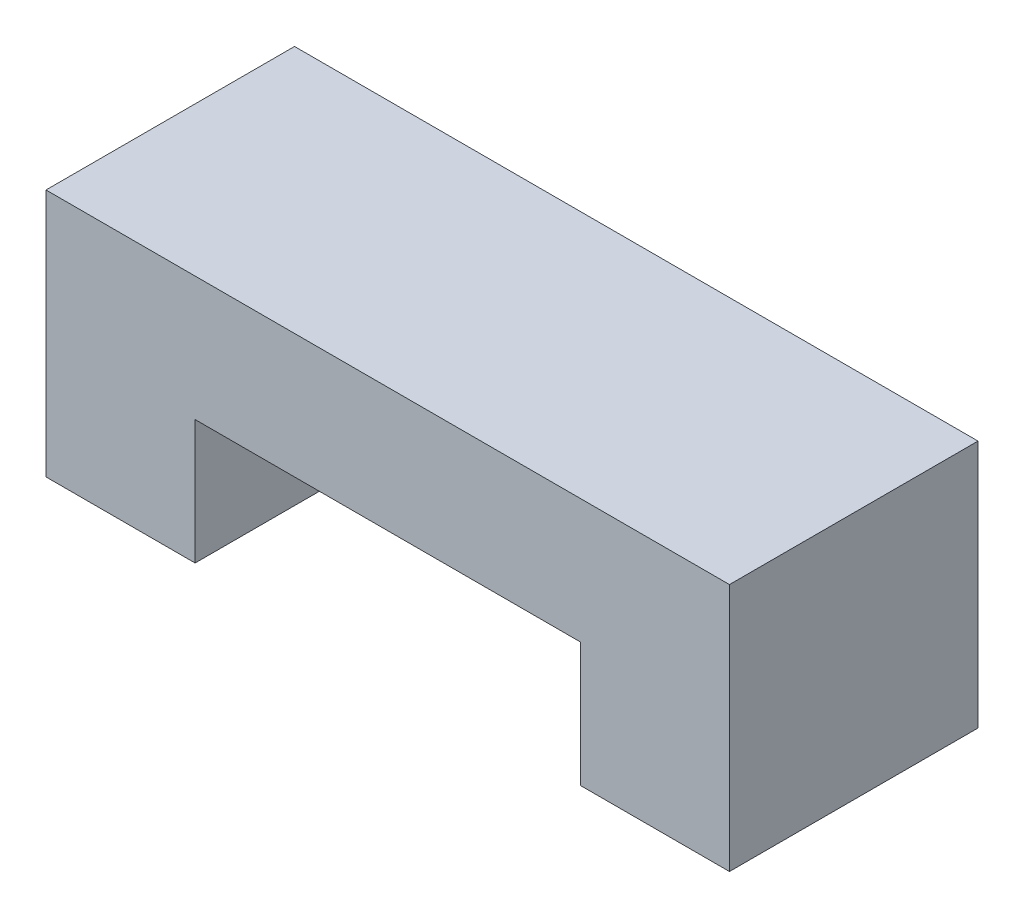
ISO-10303-21;
HEADER;
FILE_DESCRIPTION(('STEP AP214'),'2;1');
FILE_NAME('part.step','',(''),(''),'','','');
FILE_SCHEMA(('AUTOMOTIVE_DESIGN { 1 0 10303 214 1 1 1 1 }'));
ENDSEC;
DATA;
#1=APPLICATION_CONTEXT('core data for automotive mechanical design processes');
#2=APPLICATION_PROTOCOL_DEFINITION('international standard','automotive_design',2000,#1);
#3=PRODUCT_CONTEXT('',#1,'mechanical');
#4=PRODUCT('Part','Part','',(#3));
#5=PRODUCT_RELATED_PRODUCT_CATEGORY('part','',(#4));
#6=PRODUCT_DEFINITION_FORMATION('','',#4);
#7=PRODUCT_DEFINITION_CONTEXT('part definition',#1,'design');
#8=PRODUCT_DEFINITION('design','',#6,#7);
#9=PRODUCT_DEFINITION_SHAPE('','',#8);
#10=(LENGTH_UNIT() NAMED_UNIT(*) SI_UNIT(.MILLI.,.METRE.));
#11=(NAMED_UNIT(*) PLANE_ANGLE_UNIT() SI_UNIT($,.RADIAN.));
#12=(NAMED_UNIT(*) SI_UNIT($,.STERADIAN.) SOLID_ANGLE_UNIT());
#13=UNCERTAINTY_MEASURE_WITH_UNIT(LENGTH_MEASURE(1.E-05),#10,'distance_accuracy_value','');
#14=(GEOMETRIC_REPRESENTATION_CONTEXT(3) GLOBAL_UNCERTAINTY_ASSIGNED_CONTEXT((#13)) GLOBAL_UNIT_ASSIGNED_CONTEXT((#10,
#11,#12)) REPRESENTATION_CONTEXT('',''));
#15=CARTESIAN_POINT('',(0.,0.,0.));
#16=DIRECTION('',(0.,0.,1.));
#17=DIRECTION('',(1.,0.,0.));
#18=AXIS2_PLACEMENT_3D('',#15,#16,#17);
#19=CARTESIAN_POINT('',(0.,20.,20.));
#20=DIRECTION('',(1.,0.,0.));
#21=DIRECTION('',(0.,1.,0.));
#22=AXIS2_PLACEMENT_3D('',#19,#20,#21);
#23=PLANE('',#22);
#24=DIRECTION('',(0.,-1.,0.));
#25=VECTOR('',#24,1.);
#26=CARTESIAN_POINT('',(0.,20.,0.));
#27=LINE('',#26,#25);
#28=CARTESIAN_POINT('',(0.,20.,0.));
#29=VERTEX_POINT('',#28);
#30=CARTESIAN_POINT('',(0.,0.,0.));
#31=VERTEX_POINT('',#30);
#32=EDGE_CURVE('E133',#29,#31,#27,.T.);
#33=ORIENTED_EDGE('',*,*,#32,.T.);
#34=DIRECTION('',(0.,0.,-1.));
#35=VECTOR('',#34,1.);
#36=CARTESIAN_POINT('',(0.,0.,20.));
#37=LINE('',#36,#35);
#38=CARTESIAN_POINT('',(0.,0.,20.));
#39=VERTEX_POINT('',#38);
#40=EDGE_CURVE('E11',#39,#31,#37,.T.);
#41=ORIENTED_EDGE('',*,*,#40,.F.);
#42=DIRECTION('',(0.,-1.,0.));
#43=VECTOR('',#42,1.);
#44=CARTESIAN_POINT('',(0.,20.,20.));
#45=LINE('',#44,#43);
#46=CARTESIAN_POINT('',(0.,20.,20.));
#47=VERTEX_POINT('',#46);
#48=EDGE_CURVE('E147',#47,#39,#45,.T.);
#49=ORIENTED_EDGE('',*,*,#48,.F.);
#50=DIRECTION('',(0.,0.,-1.));
#51=VECTOR('',#50,1.);
#52=CARTESIAN_POINT('',(0.,20.,20.));
#53=LINE('',#52,#51);
#54=EDGE_CURVE('E129',#47,#29,#53,.T.);
#55=ORIENTED_EDGE('',*,*,#54,.T.);
#56=EDGE_LOOP('',(#33,#41,#49,#55));
#57=FACE_BOUND('',#56,.T.);
#58=ADVANCED_FACE('F37',(#57),#23,.F.);
#59=CARTESIAN_POINT('',(0.,0.,20.));
#60=DIRECTION('',(0.,1.,0.));
#61=DIRECTION('',(0.,0.,1.));
#62=AXIS2_PLACEMENT_3D('',#59,#60,#61);
#63=PLANE('',#62);
#64=DIRECTION('',(1.,0.,0.));
#65=VECTOR('',#64,1.);
#66=CARTESIAN_POINT('',(0.,0.,0.));
#67=LINE('',#66,#65);
#68=CARTESIAN_POINT('',(12.,0.,0.));
#69=VERTEX_POINT('',#68);
#70=EDGE_CURVE('E136',#31,#69,#67,.T.);
#71=ORIENTED_EDGE('',*,*,#70,.T.);
#72=DIRECTION('',(0.,0.,-1.));
#73=VECTOR('',#72,1.);
#74=CARTESIAN_POINT('',(12.,0.,20.));
#75=LINE('',#74,#73);
#76=CARTESIAN_POINT('',(12.,0.,20.));
#77=VERTEX_POINT('',#76);
#78=EDGE_CURVE('E45',#77,#69,#75,.T.);
#79=ORIENTED_EDGE('',*,*,#78,.F.);
#80=DIRECTION('',(1.,0.,0.));
#81=VECTOR('',#80,1.);
#82=CARTESIAN_POINT('',(0.,0.,20.));
#83=LINE('',#82,#81);
#84=EDGE_CURVE('E96',#39,#77,#83,.T.);
#85=ORIENTED_EDGE('',*,*,#84,.F.);
#86=ORIENTED_EDGE('',*,*,#40,.T.);
#87=EDGE_LOOP('',(#71,#79,#85,#86));
#88=FACE_BOUND('',#87,.T.);
#89=ADVANCED_FACE('F182',(#88),#63,.F.);
#90=CARTESIAN_POINT('',(12.,0.,20.));
#91=DIRECTION('',(-1.,0.,0.));
#92=DIRECTION('',(0.,0.,1.));
#93=AXIS2_PLACEMENT_3D('',#90,#91,#92);
#94=PLANE('',#93);
#95=DIRECTION('',(0.,1.,0.));
#96=VECTOR('',#95,1.);
#97=CARTESIAN_POINT('',(12.,0.,0.));
#98=LINE('',#97,#96);
#99=CARTESIAN_POINT('',(12.,10.,0.));
#100=VERTEX_POINT('',#99);
#101=EDGE_CURVE('E138',#69,#100,#98,.T.);
#102=ORIENTED_EDGE('',*,*,#101,.T.);
#103=DIRECTION('',(0.,0.,-1.));
#104=VECTOR('',#103,1.);
#105=CARTESIAN_POINT('',(12.,10.,20.));
#106=LINE('',#105,#104);
#107=CARTESIAN_POINT('',(12.,10.,20.));
#108=VERTEX_POINT('',#107);
#109=EDGE_CURVE('E154',#108,#100,#106,.T.);
#110=ORIENTED_EDGE('',*,*,#109,.F.);
#111=DIRECTION('',(0.,1.,0.));
#112=VECTOR('',#111,1.);
#113=CARTESIAN_POINT('',(12.,0.,20.));
#114=LINE('',#113,#112);
#115=EDGE_CURVE('E162',#77,#108,#114,.T.);
#116=ORIENTED_EDGE('',*,*,#115,.F.);
#117=ORIENTED_EDGE('',*,*,#78,.T.);
#118=EDGE_LOOP('',(#102,#110,#116,#117));
#119=FACE_BOUND('',#118,.T.);
#120=ADVANCED_FACE('F160',(#119),#94,.F.);
#121=CARTESIAN_POINT('',(12.,10.,20.));
#122=DIRECTION('',(0.,1.,0.));
#123=DIRECTION('',(-1.,0.,0.));
#124=AXIS2_PLACEMENT_3D('',#121,#122,#123);
#125=PLANE('',#124);
#126=DIRECTION('',(1.,0.,0.));
#127=VECTOR('',#126,1.);
#128=CARTESIAN_POINT('',(12.,10.,0.));
#129=LINE('',#128,#127);
#130=CARTESIAN_POINT('',(43.,10.,0.));
#131=VERTEX_POINT('',#130);
#132=EDGE_CURVE('E140',#100,#131,#129,.T.);
#133=ORIENTED_EDGE('',*,*,#132,.T.);
#134=DIRECTION('',(0.,0.,-1.));
#135=VECTOR('',#134,1.);
#136=CARTESIAN_POINT('',(43.,10.,20.));
#137=LINE('',#136,#135);
#138=CARTESIAN_POINT('',(43.,10.,20.));
#139=VERTEX_POINT('',#138);
#140=EDGE_CURVE('E151',#139,#131,#137,.T.);
#141=ORIENTED_EDGE('',*,*,#140,.F.);
#142=DIRECTION('',(1.,0.,0.));
#143=VECTOR('',#142,1.);
#144=CARTESIAN_POINT('',(12.,10.,20.));
#145=LINE('',#144,#143);
#146=EDGE_CURVE('E174',#108,#139,#145,.T.);
#147=ORIENTED_EDGE('',*,*,#146,.F.);
#148=ORIENTED_EDGE('',*,*,#109,.T.);
#149=EDGE_LOOP('',(#133,#141,#147,#148));
#150=FACE_BOUND('',#149,.T.);
#151=ADVANCED_FACE('F170',(#150),#125,.F.);
#152=CARTESIAN_POINT('',(43.,10.,20.));
#153=DIRECTION('',(1.,0.,0.));
#154=DIRECTION('',(0.,0.,-1.));
#155=AXIS2_PLACEMENT_3D('',#152,#153,#154);
#156=PLANE('',#155);
#157=DIRECTION('',(0.,-1.,0.));
#158=VECTOR('',#157,1.);
#159=CARTESIAN_POINT('',(43.,10.,0.));
#160=LINE('',#159,#158);
#161=CARTESIAN_POINT('',(43.,0.,0.));
#162=VERTEX_POINT('',#161);
#163=EDGE_CURVE('E142',#131,#162,#160,.T.);
#164=ORIENTED_EDGE('',*,*,#163,.T.);
#165=DIRECTION('',(0.,0.,-1.));
#166=VECTOR('',#165,1.);
#167=CARTESIAN_POINT('',(43.,0.,20.));
#168=LINE('',#167,#166);
#169=CARTESIAN_POINT('',(43.,0.,20.));
#170=VERTEX_POINT('',#169);
#171=EDGE_CURVE('E124',#170,#162,#168,.T.);
#172=ORIENTED_EDGE('',*,*,#171,.F.);
#173=DIRECTION('',(0.,-1.,0.));
#174=VECTOR('',#173,1.);
#175=CARTESIAN_POINT('',(43.,10.,20.));
#176=LINE('',#175,#174);
#177=EDGE_CURVE('E115',#139,#170,#176,.T.);
#178=ORIENTED_EDGE('',*,*,#177,.F.);
#179=ORIENTED_EDGE('',*,*,#140,.T.);
#180=EDGE_LOOP('',(#164,#172,#178,#179));
#181=FACE_BOUND('',#180,.T.);
#182=ADVANCED_FACE('F173',(#181),#156,.F.);
#183=CARTESIAN_POINT('',(43.,0.,20.));
#184=DIRECTION('',(0.,1.,0.));
#185=DIRECTION('',(0.,0.,1.));
#186=AXIS2_PLACEMENT_3D('',#183,#184,#185);
#187=PLANE('',#186);
#188=DIRECTION('',(1.,0.,0.));
#189=VECTOR('',#188,1.);
#190=CARTESIAN_POINT('',(43.,0.,0.));
#191=LINE('',#190,#189);
#192=CARTESIAN_POINT('',(55.,0.,0.));
#193=VERTEX_POINT('',#192);
#194=EDGE_CURVE('E123',#162,#193,#191,.T.);
#195=ORIENTED_EDGE('',*,*,#194,.T.);
#196=DIRECTION('',(0.,0.,-1.));
#197=VECTOR('',#196,1.);
#198=CARTESIAN_POINT('',(55.,0.,20.));
#199=LINE('',#198,#197);
#200=CARTESIAN_POINT('',(55.,0.,20.));
#201=VERTEX_POINT('',#200);
#202=EDGE_CURVE('E120',#201,#193,#199,.T.);
#203=ORIENTED_EDGE('',*,*,#202,.F.);
#204=DIRECTION('',(1.,0.,0.));
#205=VECTOR('',#204,1.);
#206=CARTESIAN_POINT('',(43.,0.,20.));
#207=LINE('',#206,#205);
#208=EDGE_CURVE('E109',#170,#201,#207,.T.);
#209=ORIENTED_EDGE('',*,*,#208,.F.);
#210=ORIENTED_EDGE('',*,*,#171,.T.);
#211=EDGE_LOOP('',(#195,#203,#209,#210));
#212=FACE_BOUND('',#211,.T.);
#213=ADVANCED_FACE('F121',(#212),#187,.F.);
#214=CARTESIAN_POINT('',(55.,0.,20.));
#215=DIRECTION('',(-1.,0.,0.));
#216=DIRECTION('',(0.,0.,1.));
#217=AXIS2_PLACEMENT_3D('',#214,#215,#216);
#218=PLANE('',#217);
#219=DIRECTION('',(0.,1.,0.));
#220=VECTOR('',#219,1.);
#221=CARTESIAN_POINT('',(55.,0.,0.));
#222=LINE('',#221,#220);
#223=CARTESIAN_POINT('',(55.,20.,0.));
#224=VERTEX_POINT('',#223);
#225=EDGE_CURVE('E82',#193,#224,#222,.T.);
#226=ORIENTED_EDGE('',*,*,#225,.T.);
#227=DIRECTION('',(0.,0.,-1.));
#228=VECTOR('',#227,1.);
#229=CARTESIAN_POINT('',(55.,20.,20.));
#230=LINE('',#229,#228);
#231=CARTESIAN_POINT('',(55.,20.,20.));
#232=VERTEX_POINT('',#231);
#233=EDGE_CURVE('E125',#232,#224,#230,.T.);
#234=ORIENTED_EDGE('',*,*,#233,.F.);
#235=DIRECTION('',(0.,1.,0.));
#236=VECTOR('',#235,1.);
#237=CARTESIAN_POINT('',(55.,0.,20.));
#238=LINE('',#237,#236);
#239=EDGE_CURVE('E113',#201,#232,#238,.T.);
#240=ORIENTED_EDGE('',*,*,#239,.F.);
#241=ORIENTED_EDGE('',*,*,#202,.T.);
#242=EDGE_LOOP('',(#226,#234,#240,#241));
#243=FACE_BOUND('',#242,.T.);
#244=ADVANCED_FACE('F127',(#243),#218,.F.);
#245=CARTESIAN_POINT('',(55.,20.,20.));
#246=DIRECTION('',(0.,-1.,0.));
#247=DIRECTION('',(1.,0.,0.));
#248=AXIS2_PLACEMENT_3D('',#245,#246,#247);
#249=PLANE('',#248);
#250=DIRECTION('',(-1.,0.,0.));
#251=VECTOR('',#250,1.);
#252=CARTESIAN_POINT('',(55.,20.,0.));
#253=LINE('',#252,#251);
#254=EDGE_CURVE('E88',#224,#29,#253,.T.);
#255=ORIENTED_EDGE('',*,*,#254,.T.);
#256=ORIENTED_EDGE('',*,*,#54,.F.);
#257=DIRECTION('',(-1.,0.,0.));
#258=VECTOR('',#257,1.);
#259=CARTESIAN_POINT('',(55.,20.,20.));
#260=LINE('',#259,#258);
#261=EDGE_CURVE('E53',#232,#47,#260,.T.);
#262=ORIENTED_EDGE('',*,*,#261,.F.);
#263=ORIENTED_EDGE('',*,*,#233,.T.);
#264=EDGE_LOOP('',(#255,#256,#262,#263));
#265=FACE_BOUND('',#264,.T.);
#266=ADVANCED_FACE('F198',(#265),#249,.F.);
#267=CARTESIAN_POINT('',(0.,0.,20.));
#268=DIRECTION('',(0.,0.,1.));
#269=DIRECTION('',(1.,0.,0.));
#270=AXIS2_PLACEMENT_3D('',#267,#268,#269);
#271=PLANE('',#270);
#272=ORIENTED_EDGE('',*,*,#48,.T.);
#273=ORIENTED_EDGE('',*,*,#84,.T.);
#274=ORIENTED_EDGE('',*,*,#115,.T.);
#275=ORIENTED_EDGE('',*,*,#146,.T.);
#276=ORIENTED_EDGE('',*,*,#177,.T.);
#277=ORIENTED_EDGE('',*,*,#208,.T.);
#278=ORIENTED_EDGE('',*,*,#239,.T.);
#279=ORIENTED_EDGE('',*,*,#261,.T.);
#280=EDGE_LOOP('',(#272,#273,#274,#275,#276,#277,#278,#279));
#281=FACE_BOUND('',#280,.T.);
#282=ADVANCED_FACE('F111',(#281),#271,.T.);
#283=CARTESIAN_POINT('',(0.,0.,0.));
#284=DIRECTION('',(0.,0.,1.));
#285=DIRECTION('',(1.,0.,0.));
#286=AXIS2_PLACEMENT_3D('',#283,#284,#285);
#287=PLANE('',#286);
#288=ORIENTED_EDGE('',*,*,#32,.F.);
#289=ORIENTED_EDGE('',*,*,#254,.F.);
#290=ORIENTED_EDGE('',*,*,#225,.F.);
#291=ORIENTED_EDGE('',*,*,#194,.F.);
#292=ORIENTED_EDGE('',*,*,#163,.F.);
#293=ORIENTED_EDGE('',*,*,#132,.F.);
#294=ORIENTED_EDGE('',*,*,#101,.F.);
#295=ORIENTED_EDGE('',*,*,#70,.F.);
#296=EDGE_LOOP('',(#288,#289,#290,#291,#292,#293,#294,#295));
#297=FACE_BOUND('',#296,.T.);
#298=ADVANCED_FACE('F166',(#297),#287,.F.);
#299=CLOSED_SHELL('',(#58,#89,#120,#151,#182,#213,#244,#266,#282,#298));
#300=MANIFOLD_SOLID_BREP('B2',#299);
#301=ADVANCED_BREP_SHAPE_REPRESENTATION('',(#18,#300),#14);
#302=SHAPE_DEFINITION_REPRESENTATION(#9,#301);
ENDSEC;
END-ISO-10303-21;
